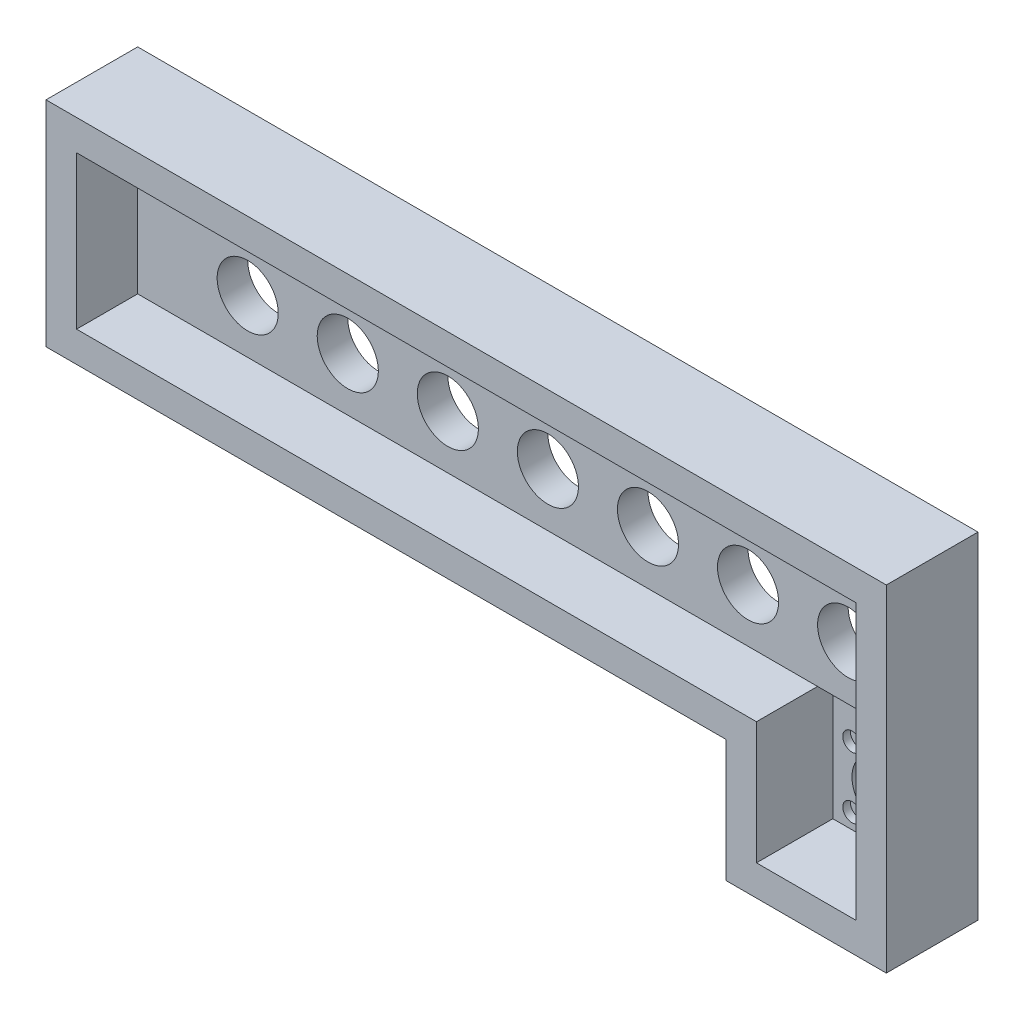
ISO-10303-21;
HEADER;
FILE_DESCRIPTION(('STEP AP214'),'2;1');
FILE_NAME('part.step','',(''),(''),'','','');
FILE_SCHEMA(('AUTOMOTIVE_DESIGN { 1 0 10303 214 1 1 1 1 }'));
ENDSEC;
DATA;
#1=APPLICATION_CONTEXT('core data for automotive mechanical design processes');
#2=APPLICATION_PROTOCOL_DEFINITION('international standard','automotive_design',2000,#1);
#3=PRODUCT_CONTEXT('',#1,'mechanical');
#4=PRODUCT('Part','Part','',(#3));
#5=PRODUCT_RELATED_PRODUCT_CATEGORY('part','',(#4));
#6=PRODUCT_DEFINITION_FORMATION('','',#4);
#7=PRODUCT_DEFINITION_CONTEXT('part definition',#1,'design');
#8=PRODUCT_DEFINITION('design','',#6,#7);
#9=PRODUCT_DEFINITION_SHAPE('','',#8);
#10=(LENGTH_UNIT() NAMED_UNIT(*) SI_UNIT(.MILLI.,.METRE.));
#11=(NAMED_UNIT(*) PLANE_ANGLE_UNIT() SI_UNIT($,.RADIAN.));
#12=(NAMED_UNIT(*) SI_UNIT($,.STERADIAN.) SOLID_ANGLE_UNIT());
#13=UNCERTAINTY_MEASURE_WITH_UNIT(LENGTH_MEASURE(1.E-05),#10,'distance_accuracy_value','');
#14=(GEOMETRIC_REPRESENTATION_CONTEXT(3) GLOBAL_UNCERTAINTY_ASSIGNED_CONTEXT((#13)) GLOBAL_UNIT_ASSIGNED_CONTEXT((#10,
#11,#12)) REPRESENTATION_CONTEXT('',''));
#15=CARTESIAN_POINT('',(0.,0.,0.));
#16=DIRECTION('',(0.,0.,1.));
#17=DIRECTION('',(1.,0.,0.));
#18=AXIS2_PLACEMENT_3D('',#15,#16,#17);
#19=CARTESIAN_POINT('',(22.25,-10.,0.));
#20=DIRECTION('',(0.,0.,1.));
#21=DIRECTION('',(1.,0.,0.));
#22=AXIS2_PLACEMENT_3D('',#19,#20,#21);
#23=CYLINDRICAL_SURFACE('',#22,2.);
#24=CARTESIAN_POINT('',(22.25,-10.,0.));
#25=DIRECTION('',(0.,0.,1.));
#26=DIRECTION('',(1.,0.,0.));
#27=AXIS2_PLACEMENT_3D('',#24,#25,#26);
#28=CIRCLE('',#27,2.);
#29=CARTESIAN_POINT('',(24.25,-10.,0.));
#30=VERTEX_POINT('',#29);
#31=EDGE_CURVE('E177',#30,#30,#28,.T.);
#32=ORIENTED_EDGE('',*,*,#31,.F.);
#33=EDGE_LOOP('',(#32));
#34=FACE_BOUND('',#33,.T.);
#35=CARTESIAN_POINT('',(22.25,-10.,1.));
#36=DIRECTION('',(0.,0.,1.));
#37=DIRECTION('',(1.,0.,0.));
#38=AXIS2_PLACEMENT_3D('',#35,#36,#37);
#39=CIRCLE('',#38,2.);
#40=CARTESIAN_POINT('',(24.25,-10.,1.));
#41=VERTEX_POINT('',#40);
#42=EDGE_CURVE('E49',#41,#41,#39,.F.);
#43=ORIENTED_EDGE('',*,*,#42,.F.);
#44=EDGE_LOOP('',(#43));
#45=FACE_BOUND('',#44,.T.);
#46=ADVANCED_FACE('F45',(#34,#45),#23,.F.);
#47=CARTESIAN_POINT('',(0.,0.,6.));
#48=DIRECTION('',(0.,0.,-1.));
#49=DIRECTION('',(-1.,0.,0.));
#50=AXIS2_PLACEMENT_3D('',#47,#48,#49);
#51=PLANE('',#50);
#52=DIRECTION('',(0.,1.,0.));
#53=VECTOR('',#52,1.);
#54=CARTESIAN_POINT('',(27.5,-7.,6.));
#55=LINE('',#54,#53);
#56=CARTESIAN_POINT('',(27.5,-15.,6.));
#57=VERTEX_POINT('',#56);
#58=CARTESIAN_POINT('',(27.5,7.,6.));
#59=VERTEX_POINT('',#58);
#60=EDGE_CURVE('E246',#57,#59,#55,.T.);
#61=ORIENTED_EDGE('',*,*,#60,.T.);
#62=DIRECTION('',(-1.,0.,0.));
#63=VECTOR('',#62,1.);
#64=CARTESIAN_POINT('',(-27.5,7.,6.));
#65=LINE('',#64,#63);
#66=CARTESIAN_POINT('',(-27.5,7.,6.));
#67=VERTEX_POINT('',#66);
#68=EDGE_CURVE('E249',#59,#67,#65,.T.);
#69=ORIENTED_EDGE('',*,*,#68,.T.);
#70=DIRECTION('',(0.,-1.,0.));
#71=VECTOR('',#70,1.);
#72=CARTESIAN_POINT('',(-27.5,-7.,6.));
#73=LINE('',#72,#71);
#74=CARTESIAN_POINT('',(-27.5,-7.,6.));
#75=VERTEX_POINT('',#74);
#76=EDGE_CURVE('E252',#67,#75,#73,.T.);
#77=ORIENTED_EDGE('',*,*,#76,.T.);
#78=DIRECTION('',(1.,0.,0.));
#79=VECTOR('',#78,1.);
#80=CARTESIAN_POINT('',(17.,-7.00000000000001,6.));
#81=LINE('',#80,#79);
#82=CARTESIAN_POINT('',(17.,-7.00000000000001,6.));
#83=VERTEX_POINT('',#82);
#84=EDGE_CURVE('E254',#75,#83,#81,.T.);
#85=ORIENTED_EDGE('',*,*,#84,.T.);
#86=DIRECTION('',(0.,-1.,0.));
#87=VECTOR('',#86,1.);
#88=CARTESIAN_POINT('',(17.,-7.00000000000001,6.));
#89=LINE('',#88,#87);
#90=CARTESIAN_POINT('',(17.,-15.,6.));
#91=VERTEX_POINT('',#90);
#92=EDGE_CURVE('E256',#83,#91,#89,.T.);
#93=ORIENTED_EDGE('',*,*,#92,.T.);
#94=DIRECTION('',(1.,0.,0.));
#95=VECTOR('',#94,1.);
#96=CARTESIAN_POINT('',(27.5,-15.,6.));
#97=LINE('',#96,#95);
#98=EDGE_CURVE('E258',#91,#57,#97,.T.);
#99=ORIENTED_EDGE('',*,*,#98,.T.);
#100=EDGE_LOOP('',(#61,#69,#77,#85,#93,#99));
#101=FACE_BOUND('',#100,.T.);
#102=DIRECTION('',(0.,1.,0.));
#103=VECTOR('',#102,1.);
#104=CARTESIAN_POINT('',(25.5,0.,6.));
#105=LINE('',#104,#103);
#106=CARTESIAN_POINT('',(25.5,-13.,6.));
#107=VERTEX_POINT('',#106);
#108=CARTESIAN_POINT('',(25.5,5.,6.));
#109=VERTEX_POINT('',#108);
#110=EDGE_CURVE('E235',#107,#109,#105,.T.);
#111=ORIENTED_EDGE('',*,*,#110,.F.);
#112=DIRECTION('',(1.,0.,0.));
#113=VECTOR('',#112,1.);
#114=CARTESIAN_POINT('',(0.,-13.,6.));
#115=LINE('',#114,#113);
#116=CARTESIAN_POINT('',(19.,-13.,6.));
#117=VERTEX_POINT('',#116);
#118=EDGE_CURVE('E233',#117,#107,#115,.T.);
#119=ORIENTED_EDGE('',*,*,#118,.F.);
#120=DIRECTION('',(0.,-1.,0.));
#121=VECTOR('',#120,1.);
#122=CARTESIAN_POINT('',(19.,0.,6.));
#123=LINE('',#122,#121);
#124=CARTESIAN_POINT('',(19.,-5.00000000000001,6.));
#125=VERTEX_POINT('',#124);
#126=EDGE_CURVE('E242',#125,#117,#123,.T.);
#127=ORIENTED_EDGE('',*,*,#126,.F.);
#128=DIRECTION('',(1.,0.,0.));
#129=VECTOR('',#128,1.);
#130=CARTESIAN_POINT('',(0.,-5.,6.));
#131=LINE('',#130,#129);
#132=CARTESIAN_POINT('',(-25.5,-5.,6.));
#133=VERTEX_POINT('',#132);
#134=EDGE_CURVE('E240',#133,#125,#131,.T.);
#135=ORIENTED_EDGE('',*,*,#134,.F.);
#136=DIRECTION('',(0.,-1.,0.));
#137=VECTOR('',#136,1.);
#138=CARTESIAN_POINT('',(-25.5,0.,6.));
#139=LINE('',#138,#137);
#140=CARTESIAN_POINT('',(-25.5,5.,6.));
#141=VERTEX_POINT('',#140);
#142=EDGE_CURVE('E238',#141,#133,#139,.T.);
#143=ORIENTED_EDGE('',*,*,#142,.F.);
#144=DIRECTION('',(-1.,0.,0.));
#145=VECTOR('',#144,1.);
#146=CARTESIAN_POINT('',(0.,5.,6.));
#147=LINE('',#146,#145);
#148=EDGE_CURVE('E236',#109,#141,#147,.T.);
#149=ORIENTED_EDGE('',*,*,#148,.F.);
#150=EDGE_LOOP('',(#111,#119,#127,#135,#143,#149));
#151=FACE_BOUND('',#150,.T.);
#152=ADVANCED_FACE('F327',(#101,#151),#51,.F.);
#153=CARTESIAN_POINT('',(-27.5,7.,6.));
#154=DIRECTION('',(0.,-1.,0.));
#155=DIRECTION('',(0.,0.,-1.));
#156=AXIS2_PLACEMENT_3D('',#153,#154,#155);
#157=PLANE('',#156);
#158=DIRECTION('',(-1.,0.,0.));
#159=VECTOR('',#158,1.);
#160=CARTESIAN_POINT('',(-27.5,7.,0.));
#161=LINE('',#160,#159);
#162=CARTESIAN_POINT('',(27.5,7.,0.));
#163=VERTEX_POINT('',#162);
#164=CARTESIAN_POINT('',(-27.5,7.,0.));
#165=VERTEX_POINT('',#164);
#166=EDGE_CURVE('E220',#163,#165,#161,.T.);
#167=ORIENTED_EDGE('',*,*,#166,.T.);
#168=DIRECTION('',(0.,0.,-1.));
#169=VECTOR('',#168,1.);
#170=CARTESIAN_POINT('',(-27.5,7.,6.));
#171=LINE('',#170,#169);
#172=EDGE_CURVE('E54',#67,#165,#171,.T.);
#173=ORIENTED_EDGE('',*,*,#172,.F.);
#174=ORIENTED_EDGE('',*,*,#68,.F.);
#175=DIRECTION('',(0.,0.,-1.));
#176=VECTOR('',#175,1.);
#177=CARTESIAN_POINT('',(27.5,7.,6.));
#178=LINE('',#177,#176);
#179=EDGE_CURVE('E13',#59,#163,#178,.T.);
#180=ORIENTED_EDGE('',*,*,#179,.T.);
#181=EDGE_LOOP('',(#167,#173,#174,#180));
#182=FACE_BOUND('',#181,.T.);
#183=ADVANCED_FACE('F47',(#182),#157,.F.);
#184=CARTESIAN_POINT('',(-27.5,-7.,6.));
#185=DIRECTION('',(1.,0.,0.));
#186=DIRECTION('',(0.,0.,-1.));
#187=AXIS2_PLACEMENT_3D('',#184,#185,#186);
#188=PLANE('',#187);
#189=DIRECTION('',(0.,-1.,0.));
#190=VECTOR('',#189,1.);
#191=CARTESIAN_POINT('',(-27.5,-7.,0.));
#192=LINE('',#191,#190);
#193=CARTESIAN_POINT('',(-27.5,-7.,0.));
#194=VERTEX_POINT('',#193);
#195=EDGE_CURVE('E263',#165,#194,#192,.T.);
#196=ORIENTED_EDGE('',*,*,#195,.T.);
#197=DIRECTION('',(0.,0.,-1.));
#198=VECTOR('',#197,1.);
#199=CARTESIAN_POINT('',(-27.5,-7.,6.));
#200=LINE('',#199,#198);
#201=EDGE_CURVE('E280',#75,#194,#200,.T.);
#202=ORIENTED_EDGE('',*,*,#201,.F.);
#203=ORIENTED_EDGE('',*,*,#76,.F.);
#204=ORIENTED_EDGE('',*,*,#172,.T.);
#205=EDGE_LOOP('',(#196,#202,#203,#204));
#206=FACE_BOUND('',#205,.T.);
#207=ADVANCED_FACE('F651',(#206),#188,.F.);
#208=CARTESIAN_POINT('',(17.,-7.00000000000001,6.));
#209=DIRECTION('',(0.,1.,0.));
#210=DIRECTION('',(-1.,0.,0.));
#211=AXIS2_PLACEMENT_3D('',#208,#209,#210);
#212=PLANE('',#211);
#213=DIRECTION('',(1.,0.,0.));
#214=VECTOR('',#213,1.);
#215=CARTESIAN_POINT('',(17.,-7.00000000000001,0.));
#216=LINE('',#215,#214);
#217=CARTESIAN_POINT('',(17.,-7.00000000000001,0.));
#218=VERTEX_POINT('',#217);
#219=EDGE_CURVE('E265',#194,#218,#216,.T.);
#220=ORIENTED_EDGE('',*,*,#219,.T.);
#221=DIRECTION('',(0.,0.,-1.));
#222=VECTOR('',#221,1.);
#223=CARTESIAN_POINT('',(17.,-7.00000000000001,6.));
#224=LINE('',#223,#222);
#225=EDGE_CURVE('E277',#83,#218,#224,.T.);
#226=ORIENTED_EDGE('',*,*,#225,.F.);
#227=ORIENTED_EDGE('',*,*,#84,.F.);
#228=ORIENTED_EDGE('',*,*,#201,.T.);
#229=EDGE_LOOP('',(#220,#226,#227,#228));
#230=FACE_BOUND('',#229,.T.);
#231=ADVANCED_FACE('F643',(#230),#212,.F.);
#232=CARTESIAN_POINT('',(17.,-7.00000000000001,6.));
#233=DIRECTION('',(1.,0.,0.));
#234=DIRECTION('',(0.,1.,0.));
#235=AXIS2_PLACEMENT_3D('',#232,#233,#234);
#236=PLANE('',#235);
#237=DIRECTION('',(0.,-1.,0.));
#238=VECTOR('',#237,1.);
#239=CARTESIAN_POINT('',(17.,-7.00000000000001,0.));
#240=LINE('',#239,#238);
#241=CARTESIAN_POINT('',(17.,-15.,0.));
#242=VERTEX_POINT('',#241);
#243=EDGE_CURVE('E267',#218,#242,#240,.T.);
#244=ORIENTED_EDGE('',*,*,#243,.T.);
#245=DIRECTION('',(0.,0.,-1.));
#246=VECTOR('',#245,1.);
#247=CARTESIAN_POINT('',(17.,-15.,6.));
#248=LINE('',#247,#246);
#249=EDGE_CURVE('E274',#91,#242,#248,.T.);
#250=ORIENTED_EDGE('',*,*,#249,.F.);
#251=ORIENTED_EDGE('',*,*,#92,.F.);
#252=ORIENTED_EDGE('',*,*,#225,.T.);
#253=EDGE_LOOP('',(#244,#250,#251,#252));
#254=FACE_BOUND('',#253,.T.);
#255=ADVANCED_FACE('F635',(#254),#236,.F.);
#256=CARTESIAN_POINT('',(27.5,-15.,6.));
#257=DIRECTION('',(0.,1.,0.));
#258=DIRECTION('',(-1.,0.,0.));
#259=AXIS2_PLACEMENT_3D('',#256,#257,#258);
#260=PLANE('',#259);
#261=DIRECTION('',(1.,0.,0.));
#262=VECTOR('',#261,1.);
#263=CARTESIAN_POINT('',(27.5,-15.,0.));
#264=LINE('',#263,#262);
#265=CARTESIAN_POINT('',(27.5,-15.,0.));
#266=VERTEX_POINT('',#265);
#267=EDGE_CURVE('E269',#242,#266,#264,.T.);
#268=ORIENTED_EDGE('',*,*,#267,.T.);
#269=DIRECTION('',(0.,0.,-1.));
#270=VECTOR('',#269,1.);
#271=CARTESIAN_POINT('',(27.5,-15.,6.));
#272=LINE('',#271,#270);
#273=EDGE_CURVE('E261',#57,#266,#272,.T.);
#274=ORIENTED_EDGE('',*,*,#273,.F.);
#275=ORIENTED_EDGE('',*,*,#98,.F.);
#276=ORIENTED_EDGE('',*,*,#249,.T.);
#277=EDGE_LOOP('',(#268,#274,#275,#276));
#278=FACE_BOUND('',#277,.T.);
#279=ADVANCED_FACE('F627',(#278),#260,.F.);
#280=CARTESIAN_POINT('',(27.5,-7.,6.));
#281=DIRECTION('',(-1.,0.,0.));
#282=DIRECTION('',(0.,0.,1.));
#283=AXIS2_PLACEMENT_3D('',#280,#281,#282);
#284=PLANE('',#283);
#285=DIRECTION('',(0.,1.,0.));
#286=VECTOR('',#285,1.);
#287=CARTESIAN_POINT('',(27.5,-7.,0.));
#288=LINE('',#287,#286);
#289=EDGE_CURVE('E250',#266,#163,#288,.T.);
#290=ORIENTED_EDGE('',*,*,#289,.T.);
#291=ORIENTED_EDGE('',*,*,#179,.F.);
#292=ORIENTED_EDGE('',*,*,#60,.F.);
#293=ORIENTED_EDGE('',*,*,#273,.T.);
#294=EDGE_LOOP('',(#290,#291,#292,#293));
#295=FACE_BOUND('',#294,.T.);
#296=ADVANCED_FACE('F619',(#295),#284,.F.);
#297=CARTESIAN_POINT('',(0.,0.,0.));
#298=DIRECTION('',(0.,0.,-1.));
#299=DIRECTION('',(-1.,0.,0.));
#300=AXIS2_PLACEMENT_3D('',#297,#298,#299);
#301=PLANE('',#300);
#302=ORIENTED_EDGE('',*,*,#31,.T.);
#303=EDGE_LOOP('',(#302));
#304=FACE_BOUND('',#303,.T.);
#305=CARTESIAN_POINT('',(17.5,2.8,0.));
#306=DIRECTION('',(0.,0.,-1.));
#307=DIRECTION('',(-1.,0.,0.));
#308=AXIS2_PLACEMENT_3D('',#305,#306,#307);
#309=CIRCLE('',#308,1.5);
#310=CARTESIAN_POINT('',(16.,2.8,0.));
#311=VERTEX_POINT('',#310);
#312=EDGE_CURVE('E181',#311,#311,#309,.T.);
#313=ORIENTED_EDGE('',*,*,#312,.F.);
#314=EDGE_LOOP('',(#313));
#315=FACE_BOUND('',#314,.T.);
#316=CARTESIAN_POINT('',(-8.5,2.8,0.));
#317=DIRECTION('',(0.,0.,-1.));
#318=DIRECTION('',(-1.,0.,0.));
#319=AXIS2_PLACEMENT_3D('',#316,#317,#318);
#320=CIRCLE('',#319,1.5);
#321=CARTESIAN_POINT('',(-10.,2.8,0.));
#322=VERTEX_POINT('',#321);
#323=EDGE_CURVE('E180',#322,#322,#320,.T.);
#324=ORIENTED_EDGE('',*,*,#323,.F.);
#325=EDGE_LOOP('',(#324));
#326=FACE_BOUND('',#325,.T.);
#327=CARTESIAN_POINT('',(21.,-1.5,0.));
#328=DIRECTION('',(0.,0.,-1.));
#329=DIRECTION('',(-1.,0.,0.));
#330=AXIS2_PLACEMENT_3D('',#327,#328,#329);
#331=CIRCLE('',#330,2.);
#332=CARTESIAN_POINT('',(19.,-1.5,0.));
#333=VERTEX_POINT('',#332);
#334=EDGE_CURVE('E187',#333,#333,#331,.T.);
#335=ORIENTED_EDGE('',*,*,#334,.F.);
#336=EDGE_LOOP('',(#335));
#337=FACE_BOUND('',#336,.T.);
#338=CARTESIAN_POINT('',(14.45,-1.5,0.));
#339=DIRECTION('',(0.,0.,-1.));
#340=DIRECTION('',(-1.,0.,0.));
#341=AXIS2_PLACEMENT_3D('',#338,#339,#340);
#342=CIRCLE('',#341,2.);
#343=CARTESIAN_POINT('',(12.45,-1.5,0.));
#344=VERTEX_POINT('',#343);
#345=EDGE_CURVE('E191',#344,#344,#342,.T.);
#346=ORIENTED_EDGE('',*,*,#345,.F.);
#347=EDGE_LOOP('',(#346));
#348=FACE_BOUND('',#347,.T.);
#349=CARTESIAN_POINT('',(7.9,-1.5,0.));
#350=DIRECTION('',(0.,0.,-1.));
#351=DIRECTION('',(-1.,0.,0.));
#352=AXIS2_PLACEMENT_3D('',#349,#350,#351);
#353=CIRCLE('',#352,2.);
#354=CARTESIAN_POINT('',(5.9,-1.5,0.));
#355=VERTEX_POINT('',#354);
#356=EDGE_CURVE('E194',#355,#355,#353,.T.);
#357=ORIENTED_EDGE('',*,*,#356,.F.);
#358=EDGE_LOOP('',(#357));
#359=FACE_BOUND('',#358,.T.);
#360=CARTESIAN_POINT('',(1.35,-1.5,0.));
#361=DIRECTION('',(0.,0.,-1.));
#362=DIRECTION('',(-1.,0.,0.));
#363=AXIS2_PLACEMENT_3D('',#360,#361,#362);
#364=CIRCLE('',#363,2.);
#365=CARTESIAN_POINT('',(-0.649999999999999,-1.5,0.));
#366=VERTEX_POINT('',#365);
#367=EDGE_CURVE('E197',#366,#366,#364,.T.);
#368=ORIENTED_EDGE('',*,*,#367,.F.);
#369=EDGE_LOOP('',(#368));
#370=FACE_BOUND('',#369,.T.);
#371=CARTESIAN_POINT('',(-5.2,-1.5,0.));
#372=DIRECTION('',(0.,0.,-1.));
#373=DIRECTION('',(-1.,0.,0.));
#374=AXIS2_PLACEMENT_3D('',#371,#372,#373);
#375=CIRCLE('',#374,2.);
#376=CARTESIAN_POINT('',(-7.2,-1.5,0.));
#377=VERTEX_POINT('',#376);
#378=EDGE_CURVE('E200',#377,#377,#375,.T.);
#379=ORIENTED_EDGE('',*,*,#378,.F.);
#380=EDGE_LOOP('',(#379));
#381=FACE_BOUND('',#380,.T.);
#382=CARTESIAN_POINT('',(-11.75,-1.5,0.));
#383=DIRECTION('',(0.,0.,-1.));
#384=DIRECTION('',(-1.,0.,0.));
#385=AXIS2_PLACEMENT_3D('',#382,#383,#384);
#386=CIRCLE('',#385,2.);
#387=CARTESIAN_POINT('',(-13.75,-1.5,0.));
#388=VERTEX_POINT('',#387);
#389=EDGE_CURVE('E203',#388,#388,#386,.T.);
#390=ORIENTED_EDGE('',*,*,#389,.F.);
#391=EDGE_LOOP('',(#390));
#392=FACE_BOUND('',#391,.T.);
#393=CARTESIAN_POINT('',(-18.3,-1.5,0.));
#394=DIRECTION('',(0.,0.,-1.));
#395=DIRECTION('',(-1.,0.,0.));
#396=AXIS2_PLACEMENT_3D('',#393,#394,#395);
#397=CIRCLE('',#396,2.);
#398=CARTESIAN_POINT('',(-20.3,-1.5,0.));
#399=VERTEX_POINT('',#398);
#400=EDGE_CURVE('E206',#399,#399,#397,.T.);
#401=ORIENTED_EDGE('',*,*,#400,.F.);
#402=EDGE_LOOP('',(#401));
#403=FACE_BOUND('',#402,.T.);
#404=ORIENTED_EDGE('',*,*,#166,.F.);
#405=ORIENTED_EDGE('',*,*,#289,.F.);
#406=ORIENTED_EDGE('',*,*,#267,.F.);
#407=ORIENTED_EDGE('',*,*,#243,.F.);
#408=ORIENTED_EDGE('',*,*,#219,.F.);
#409=ORIENTED_EDGE('',*,*,#195,.F.);
#410=EDGE_LOOP('',(#404,#405,#406,#407,#408,#409));
#411=FACE_BOUND('',#410,.T.);
#412=ADVANCED_FACE('F611',(#304,#315,#326,#337,#348,#359,#370,#381,#392,#403,#411),#301,.T.);
#413=CARTESIAN_POINT('',(-27.5,5.,6.));
#414=DIRECTION('',(0.,-1.,0.));
#415=DIRECTION('',(0.,0.,-1.));
#416=AXIS2_PLACEMENT_3D('',#413,#414,#415);
#417=PLANE('',#416);
#418=DIRECTION('',(-1.,0.,0.));
#419=VECTOR('',#418,1.);
#420=CARTESIAN_POINT('',(0.,5.,2.));
#421=LINE('',#420,#419);
#422=CARTESIAN_POINT('',(25.5,5.,2.));
#423=VERTEX_POINT('',#422);
#424=CARTESIAN_POINT('',(-25.5,5.,2.));
#425=VERTEX_POINT('',#424);
#426=EDGE_CURVE('E210',#423,#425,#421,.T.);
#427=ORIENTED_EDGE('',*,*,#426,.F.);
#428=DIRECTION('',(0.,0.,-1.));
#429=VECTOR('',#428,1.);
#430=CARTESIAN_POINT('',(25.5,5.,6.));
#431=LINE('',#430,#429);
#432=EDGE_CURVE('E217',#109,#423,#431,.T.);
#433=ORIENTED_EDGE('',*,*,#432,.F.);
#434=ORIENTED_EDGE('',*,*,#148,.T.);
#435=DIRECTION('',(0.,0.,-1.));
#436=VECTOR('',#435,1.);
#437=CARTESIAN_POINT('',(-25.5,5.,6.));
#438=LINE('',#437,#436);
#439=EDGE_CURVE('E214',#141,#425,#438,.T.);
#440=ORIENTED_EDGE('',*,*,#439,.T.);
#441=EDGE_LOOP('',(#427,#433,#434,#440));
#442=FACE_BOUND('',#441,.T.);
#443=ADVANCED_FACE('F603',(#442),#417,.T.);
#444=CARTESIAN_POINT('',(-25.5,-7.,6.));
#445=DIRECTION('',(1.,0.,0.));
#446=DIRECTION('',(0.,0.,-1.));
#447=AXIS2_PLACEMENT_3D('',#444,#445,#446);
#448=PLANE('',#447);
#449=DIRECTION('',(0.,-1.,0.));
#450=VECTOR('',#449,1.);
#451=CARTESIAN_POINT('',(-25.5,0.,2.));
#452=LINE('',#451,#450);
#453=CARTESIAN_POINT('',(-25.5,-5.,2.));
#454=VERTEX_POINT('',#453);
#455=EDGE_CURVE('E212',#425,#454,#452,.T.);
#456=ORIENTED_EDGE('',*,*,#455,.F.);
#457=ORIENTED_EDGE('',*,*,#439,.F.);
#458=ORIENTED_EDGE('',*,*,#142,.T.);
#459=DIRECTION('',(0.,0.,-1.));
#460=VECTOR('',#459,1.);
#461=CARTESIAN_POINT('',(-25.5,-5.,6.));
#462=LINE('',#461,#460);
#463=EDGE_CURVE('E218',#133,#454,#462,.T.);
#464=ORIENTED_EDGE('',*,*,#463,.T.);
#465=EDGE_LOOP('',(#456,#457,#458,#464));
#466=FACE_BOUND('',#465,.T.);
#467=ADVANCED_FACE('F597',(#466),#448,.T.);
#468=CARTESIAN_POINT('',(17.,-5.00000000000001,6.));
#469=DIRECTION('',(0.,1.,0.));
#470=DIRECTION('',(-1.,0.,0.));
#471=AXIS2_PLACEMENT_3D('',#468,#469,#470);
#472=PLANE('',#471);
#473=DIRECTION('',(1.,0.,0.));
#474=VECTOR('',#473,1.);
#475=CARTESIAN_POINT('',(0.,-5.,2.));
#476=LINE('',#475,#474);
#477=CARTESIAN_POINT('',(19.,-5.00000000000001,2.));
#478=VERTEX_POINT('',#477);
#479=EDGE_CURVE('E222',#454,#478,#476,.T.);
#480=ORIENTED_EDGE('',*,*,#479,.F.);
#481=ORIENTED_EDGE('',*,*,#463,.F.);
#482=ORIENTED_EDGE('',*,*,#134,.T.);
#483=DIRECTION('',(0.,0.,-1.));
#484=VECTOR('',#483,1.);
#485=CARTESIAN_POINT('',(19.,-5.00000000000001,6.));
#486=LINE('',#485,#484);
#487=EDGE_CURVE('E225',#125,#478,#486,.T.);
#488=ORIENTED_EDGE('',*,*,#487,.T.);
#489=EDGE_LOOP('',(#480,#481,#482,#488));
#490=FACE_BOUND('',#489,.T.);
#491=ADVANCED_FACE('F493',(#490),#472,.T.);
#492=CARTESIAN_POINT('',(19.,-7.00000000000001,6.));
#493=DIRECTION('',(1.,0.,0.));
#494=DIRECTION('',(0.,1.,0.));
#495=AXIS2_PLACEMENT_3D('',#492,#493,#494);
#496=PLANE('',#495);
#497=DIRECTION('',(0.,0.,-1.));
#498=VECTOR('',#497,1.);
#499=CARTESIAN_POINT('',(19.,-13.,6.));
#500=LINE('',#499,#498);
#501=CARTESIAN_POINT('',(19.,-13.,1.));
#502=VERTEX_POINT('',#501);
#503=EDGE_CURVE('E70',#117,#502,#500,.T.);
#504=ORIENTED_EDGE('',*,*,#503,.T.);
#505=DIRECTION('',(0.,-1.,0.));
#506=VECTOR('',#505,1.);
#507=CARTESIAN_POINT('',(19.,-13.,1.));
#508=LINE('',#507,#506);
#509=CARTESIAN_POINT('',(19.,-5.00000000000001,1.));
#510=VERTEX_POINT('',#509);
#511=EDGE_CURVE('E162',#510,#502,#508,.T.);
#512=ORIENTED_EDGE('',*,*,#511,.F.);
#513=DIRECTION('',(0.,0.,1.));
#514=VECTOR('',#513,1.);
#515=CARTESIAN_POINT('',(19.,-5.00000000000001,1.));
#516=LINE('',#515,#514);
#517=EDGE_CURVE('E153',#510,#478,#516,.T.);
#518=ORIENTED_EDGE('',*,*,#517,.T.);
#519=ORIENTED_EDGE('',*,*,#487,.F.);
#520=ORIENTED_EDGE('',*,*,#126,.T.);
#521=EDGE_LOOP('',(#504,#512,#518,#519,#520));
#522=FACE_BOUND('',#521,.T.);
#523=ADVANCED_FACE('F482',(#522),#496,.T.);
#524=CARTESIAN_POINT('',(27.5,-13.,6.));
#525=DIRECTION('',(0.,1.,0.));
#526=DIRECTION('',(-1.,0.,0.));
#527=AXIS2_PLACEMENT_3D('',#524,#525,#526);
#528=PLANE('',#527);
#529=DIRECTION('',(0.,0.,-1.));
#530=VECTOR('',#529,1.);
#531=CARTESIAN_POINT('',(25.5,-13.,6.));
#532=LINE('',#531,#530);
#533=CARTESIAN_POINT('',(25.5,-13.,1.));
#534=VERTEX_POINT('',#533);
#535=EDGE_CURVE('E231',#107,#534,#532,.T.);
#536=ORIENTED_EDGE('',*,*,#535,.T.);
#537=DIRECTION('',(1.,0.,0.));
#538=VECTOR('',#537,1.);
#539=CARTESIAN_POINT('',(25.5,-13.,1.));
#540=LINE('',#539,#538);
#541=EDGE_CURVE('E154',#502,#534,#540,.T.);
#542=ORIENTED_EDGE('',*,*,#541,.F.);
#543=ORIENTED_EDGE('',*,*,#503,.F.);
#544=ORIENTED_EDGE('',*,*,#118,.T.);
#545=EDGE_LOOP('',(#536,#542,#543,#544));
#546=FACE_BOUND('',#545,.T.);
#547=ADVANCED_FACE('F469',(#546),#528,.T.);
#548=CARTESIAN_POINT('',(25.5,-7.,6.));
#549=DIRECTION('',(-1.,0.,0.));
#550=DIRECTION('',(0.,0.,1.));
#551=AXIS2_PLACEMENT_3D('',#548,#549,#550);
#552=PLANE('',#551);
#553=DIRECTION('',(0.,1.,0.));
#554=VECTOR('',#553,1.);
#555=CARTESIAN_POINT('',(25.5,0.,2.));
#556=LINE('',#555,#554);
#557=CARTESIAN_POINT('',(25.5,-5.00000000000001,2.));
#558=VERTEX_POINT('',#557);
#559=EDGE_CURVE('E152',#558,#423,#556,.T.);
#560=ORIENTED_EDGE('',*,*,#559,.F.);
#561=DIRECTION('',(0.,0.,1.));
#562=VECTOR('',#561,1.);
#563=CARTESIAN_POINT('',(25.5,-5.00000000000001,1.));
#564=LINE('',#563,#562);
#565=CARTESIAN_POINT('',(25.5,-5.00000000000001,1.));
#566=VERTEX_POINT('',#565);
#567=EDGE_CURVE('E62',#566,#558,#564,.T.);
#568=ORIENTED_EDGE('',*,*,#567,.F.);
#569=DIRECTION('',(0.,1.,0.));
#570=VECTOR('',#569,1.);
#571=CARTESIAN_POINT('',(25.5,-13.,1.));
#572=LINE('',#571,#570);
#573=EDGE_CURVE('E149',#534,#566,#572,.T.);
#574=ORIENTED_EDGE('',*,*,#573,.F.);
#575=ORIENTED_EDGE('',*,*,#535,.F.);
#576=ORIENTED_EDGE('',*,*,#110,.T.);
#577=ORIENTED_EDGE('',*,*,#432,.T.);
#578=EDGE_LOOP('',(#560,#568,#574,#575,#576,#577));
#579=FACE_BOUND('',#578,.T.);
#580=ADVANCED_FACE('F146',(#579),#552,.T.);
#581=CARTESIAN_POINT('',(0.,0.,2.));
#582=DIRECTION('',(0.,0.,-1.));
#583=DIRECTION('',(-1.,0.,0.));
#584=AXIS2_PLACEMENT_3D('',#581,#582,#583);
#585=PLANE('',#584);
#586=CARTESIAN_POINT('',(17.5,2.8,2.));
#587=DIRECTION('',(0.,0.,-1.));
#588=DIRECTION('',(-1.,0.,0.));
#589=AXIS2_PLACEMENT_3D('',#586,#587,#588);
#590=CIRCLE('',#589,1.5);
#591=CARTESIAN_POINT('',(16.,2.8,2.));
#592=VERTEX_POINT('',#591);
#593=EDGE_CURVE('E209',#592,#592,#590,.T.);
#594=ORIENTED_EDGE('',*,*,#593,.T.);
#595=EDGE_LOOP('',(#594));
#596=FACE_BOUND('',#595,.T.);
#597=CARTESIAN_POINT('',(-8.5,2.8,2.));
#598=DIRECTION('',(0.,0.,-1.));
#599=DIRECTION('',(-1.,0.,0.));
#600=AXIS2_PLACEMENT_3D('',#597,#598,#599);
#601=CIRCLE('',#600,1.5);
#602=CARTESIAN_POINT('',(-10.,2.8,2.));
#603=VERTEX_POINT('',#602);
#604=EDGE_CURVE('E184',#603,#603,#601,.T.);
#605=ORIENTED_EDGE('',*,*,#604,.T.);
#606=EDGE_LOOP('',(#605));
#607=FACE_BOUND('',#606,.T.);
#608=CARTESIAN_POINT('',(21.,-1.5,2.));
#609=DIRECTION('',(0.,0.,-1.));
#610=DIRECTION('',(-1.,0.,0.));
#611=AXIS2_PLACEMENT_3D('',#608,#609,#610);
#612=CIRCLE('',#611,2.);
#613=CARTESIAN_POINT('',(19.,-1.5,2.));
#614=VERTEX_POINT('',#613);
#615=EDGE_CURVE('E213',#614,#614,#612,.T.);
#616=ORIENTED_EDGE('',*,*,#615,.T.);
#617=EDGE_LOOP('',(#616));
#618=FACE_BOUND('',#617,.T.);
#619=CARTESIAN_POINT('',(14.45,-1.5,2.));
#620=DIRECTION('',(0.,0.,-1.));
#621=DIRECTION('',(-1.,0.,0.));
#622=AXIS2_PLACEMENT_3D('',#619,#620,#621);
#623=CIRCLE('',#622,2.);
#624=CARTESIAN_POINT('',(12.45,-1.5,2.));
#625=VERTEX_POINT('',#624);
#626=EDGE_CURVE('E299',#625,#625,#623,.T.);
#627=ORIENTED_EDGE('',*,*,#626,.T.);
#628=EDGE_LOOP('',(#627));
#629=FACE_BOUND('',#628,.T.);
#630=CARTESIAN_POINT('',(7.9,-1.5,2.));
#631=DIRECTION('',(0.,0.,-1.));
#632=DIRECTION('',(-1.,0.,0.));
#633=AXIS2_PLACEMENT_3D('',#630,#631,#632);
#634=CIRCLE('',#633,2.);
#635=CARTESIAN_POINT('',(5.9,-1.5,2.));
#636=VERTEX_POINT('',#635);
#637=EDGE_CURVE('E296',#636,#636,#634,.T.);
#638=ORIENTED_EDGE('',*,*,#637,.T.);
#639=EDGE_LOOP('',(#638));
#640=FACE_BOUND('',#639,.T.);
#641=CARTESIAN_POINT('',(1.35,-1.5,2.));
#642=DIRECTION('',(0.,0.,-1.));
#643=DIRECTION('',(-1.,0.,0.));
#644=AXIS2_PLACEMENT_3D('',#641,#642,#643);
#645=CIRCLE('',#644,2.);
#646=CARTESIAN_POINT('',(-0.649999999999999,-1.5,2.));
#647=VERTEX_POINT('',#646);
#648=EDGE_CURVE('E293',#647,#647,#645,.T.);
#649=ORIENTED_EDGE('',*,*,#648,.T.);
#650=EDGE_LOOP('',(#649));
#651=FACE_BOUND('',#650,.T.);
#652=CARTESIAN_POINT('',(-5.2,-1.5,2.));
#653=DIRECTION('',(0.,0.,-1.));
#654=DIRECTION('',(-1.,0.,0.));
#655=AXIS2_PLACEMENT_3D('',#652,#653,#654);
#656=CIRCLE('',#655,2.);
#657=CARTESIAN_POINT('',(-7.2,-1.5,2.));
#658=VERTEX_POINT('',#657);
#659=EDGE_CURVE('E290',#658,#658,#656,.T.);
#660=ORIENTED_EDGE('',*,*,#659,.T.);
#661=EDGE_LOOP('',(#660));
#662=FACE_BOUND('',#661,.T.);
#663=CARTESIAN_POINT('',(-11.75,-1.5,2.));
#664=DIRECTION('',(0.,0.,-1.));
#665=DIRECTION('',(-1.,0.,0.));
#666=AXIS2_PLACEMENT_3D('',#663,#664,#665);
#667=CIRCLE('',#666,2.);
#668=CARTESIAN_POINT('',(-13.75,-1.5,2.));
#669=VERTEX_POINT('',#668);
#670=EDGE_CURVE('E287',#669,#669,#667,.T.);
#671=ORIENTED_EDGE('',*,*,#670,.T.);
#672=EDGE_LOOP('',(#671));
#673=FACE_BOUND('',#672,.T.);
#674=CARTESIAN_POINT('',(-18.3,-1.5,2.));
#675=DIRECTION('',(0.,0.,-1.));
#676=DIRECTION('',(-1.,0.,0.));
#677=AXIS2_PLACEMENT_3D('',#674,#675,#676);
#678=CIRCLE('',#677,2.);
#679=CARTESIAN_POINT('',(-20.3,-1.5,2.));
#680=VERTEX_POINT('',#679);
#681=EDGE_CURVE('E190',#680,#680,#678,.T.);
#682=ORIENTED_EDGE('',*,*,#681,.T.);
#683=EDGE_LOOP('',(#682));
#684=FACE_BOUND('',#683,.T.);
#685=ORIENTED_EDGE('',*,*,#479,.T.);
#686=DIRECTION('',(-1.,0.,0.));
#687=VECTOR('',#686,1.);
#688=CARTESIAN_POINT('',(25.5,-5.00000000000001,2.));
#689=LINE('',#688,#687);
#690=EDGE_CURVE('E166',#558,#478,#689,.T.);
#691=ORIENTED_EDGE('',*,*,#690,.F.);
#692=ORIENTED_EDGE('',*,*,#559,.T.);
#693=ORIENTED_EDGE('',*,*,#426,.T.);
#694=ORIENTED_EDGE('',*,*,#455,.T.);
#695=EDGE_LOOP('',(#685,#691,#692,#693,#694));
#696=FACE_BOUND('',#695,.T.);
#697=ADVANCED_FACE('F308',(#596,#607,#618,#629,#640,#651,#662,#673,#684,#696),#585,.F.);
#698=CARTESIAN_POINT('',(-18.3,-1.5,6.));
#699=DIRECTION('',(0.,0.,-1.));
#700=DIRECTION('',(-1.,0.,0.));
#701=AXIS2_PLACEMENT_3D('',#698,#699,#700);
#702=CYLINDRICAL_SURFACE('',#701,2.);
#703=ORIENTED_EDGE('',*,*,#400,.T.);
#704=EDGE_LOOP('',(#703));
#705=FACE_BOUND('',#704,.T.);
#706=ORIENTED_EDGE('',*,*,#681,.F.);
#707=EDGE_LOOP('',(#706));
#708=FACE_BOUND('',#707,.T.);
#709=ADVANCED_FACE('F565',(#705,#708),#702,.F.);
#710=CARTESIAN_POINT('',(-11.75,-1.5,6.));
#711=DIRECTION('',(0.,0.,-1.));
#712=DIRECTION('',(-1.,0.,0.));
#713=AXIS2_PLACEMENT_3D('',#710,#711,#712);
#714=CYLINDRICAL_SURFACE('',#713,2.);
#715=ORIENTED_EDGE('',*,*,#389,.T.);
#716=EDGE_LOOP('',(#715));
#717=FACE_BOUND('',#716,.T.);
#718=ORIENTED_EDGE('',*,*,#670,.F.);
#719=EDGE_LOOP('',(#718));
#720=FACE_BOUND('',#719,.T.);
#721=ADVANCED_FACE('F556',(#717,#720),#714,.F.);
#722=CARTESIAN_POINT('',(-5.2,-1.5,6.));
#723=DIRECTION('',(0.,0.,-1.));
#724=DIRECTION('',(-1.,0.,0.));
#725=AXIS2_PLACEMENT_3D('',#722,#723,#724);
#726=CYLINDRICAL_SURFACE('',#725,2.);
#727=ORIENTED_EDGE('',*,*,#378,.T.);
#728=EDGE_LOOP('',(#727));
#729=FACE_BOUND('',#728,.T.);
#730=ORIENTED_EDGE('',*,*,#659,.F.);
#731=EDGE_LOOP('',(#730));
#732=FACE_BOUND('',#731,.T.);
#733=ADVANCED_FACE('F547',(#729,#732),#726,.F.);
#734=CARTESIAN_POINT('',(1.35,-1.5,6.));
#735=DIRECTION('',(0.,0.,-1.));
#736=DIRECTION('',(-1.,0.,0.));
#737=AXIS2_PLACEMENT_3D('',#734,#735,#736);
#738=CYLINDRICAL_SURFACE('',#737,2.);
#739=ORIENTED_EDGE('',*,*,#367,.T.);
#740=EDGE_LOOP('',(#739));
#741=FACE_BOUND('',#740,.T.);
#742=ORIENTED_EDGE('',*,*,#648,.F.);
#743=EDGE_LOOP('',(#742));
#744=FACE_BOUND('',#743,.T.);
#745=ADVANCED_FACE('F538',(#741,#744),#738,.F.);
#746=CARTESIAN_POINT('',(7.9,-1.5,6.));
#747=DIRECTION('',(0.,0.,-1.));
#748=DIRECTION('',(-1.,0.,0.));
#749=AXIS2_PLACEMENT_3D('',#746,#747,#748);
#750=CYLINDRICAL_SURFACE('',#749,2.);
#751=ORIENTED_EDGE('',*,*,#356,.T.);
#752=EDGE_LOOP('',(#751));
#753=FACE_BOUND('',#752,.T.);
#754=ORIENTED_EDGE('',*,*,#637,.F.);
#755=EDGE_LOOP('',(#754));
#756=FACE_BOUND('',#755,.T.);
#757=ADVANCED_FACE('F529',(#753,#756),#750,.F.);
#758=CARTESIAN_POINT('',(14.45,-1.5,6.));
#759=DIRECTION('',(0.,0.,-1.));
#760=DIRECTION('',(-1.,0.,0.));
#761=AXIS2_PLACEMENT_3D('',#758,#759,#760);
#762=CYLINDRICAL_SURFACE('',#761,2.);
#763=ORIENTED_EDGE('',*,*,#345,.T.);
#764=EDGE_LOOP('',(#763));
#765=FACE_BOUND('',#764,.T.);
#766=ORIENTED_EDGE('',*,*,#626,.F.);
#767=EDGE_LOOP('',(#766));
#768=FACE_BOUND('',#767,.T.);
#769=ADVANCED_FACE('F520',(#765,#768),#762,.F.);
#770=CARTESIAN_POINT('',(21.,-1.5,6.));
#771=DIRECTION('',(0.,0.,-1.));
#772=DIRECTION('',(-1.,0.,0.));
#773=AXIS2_PLACEMENT_3D('',#770,#771,#772);
#774=CYLINDRICAL_SURFACE('',#773,2.);
#775=ORIENTED_EDGE('',*,*,#334,.T.);
#776=EDGE_LOOP('',(#775));
#777=FACE_BOUND('',#776,.T.);
#778=ORIENTED_EDGE('',*,*,#615,.F.);
#779=EDGE_LOOP('',(#778));
#780=FACE_BOUND('',#779,.T.);
#781=ADVANCED_FACE('F322',(#777,#780),#774,.F.);
#782=CARTESIAN_POINT('',(-8.5,2.8,6.));
#783=DIRECTION('',(0.,0.,-1.));
#784=DIRECTION('',(-1.,0.,0.));
#785=AXIS2_PLACEMENT_3D('',#782,#783,#784);
#786=CYLINDRICAL_SURFACE('',#785,1.5);
#787=ORIENTED_EDGE('',*,*,#323,.T.);
#788=EDGE_LOOP('',(#787));
#789=FACE_BOUND('',#788,.T.);
#790=ORIENTED_EDGE('',*,*,#604,.F.);
#791=EDGE_LOOP('',(#790));
#792=FACE_BOUND('',#791,.T.);
#793=ADVANCED_FACE('F313',(#789,#792),#786,.F.);
#794=CARTESIAN_POINT('',(17.5,2.8,6.));
#795=DIRECTION('',(0.,0.,-1.));
#796=DIRECTION('',(-1.,0.,0.));
#797=AXIS2_PLACEMENT_3D('',#794,#795,#796);
#798=CYLINDRICAL_SURFACE('',#797,1.5);
#799=ORIENTED_EDGE('',*,*,#312,.T.);
#800=EDGE_LOOP('',(#799));
#801=FACE_BOUND('',#800,.T.);
#802=ORIENTED_EDGE('',*,*,#593,.F.);
#803=EDGE_LOOP('',(#802));
#804=FACE_BOUND('',#803,.T.);
#805=ADVANCED_FACE('F311',(#801,#804),#798,.F.);
#806=CARTESIAN_POINT('',(0.,0.,1.));
#807=DIRECTION('',(0.,0.,1.));
#808=DIRECTION('',(1.,0.,0.));
#809=AXIS2_PLACEMENT_3D('',#806,#807,#808);
#810=PLANE('',#809);
#811=CARTESIAN_POINT('',(20.25,-12.,1.));
#812=DIRECTION('',(0.,0.,1.));
#813=DIRECTION('',(1.,0.,0.));
#814=AXIS2_PLACEMENT_3D('',#811,#812,#813);
#815=CIRCLE('',#814,0.6);
#816=CARTESIAN_POINT('',(20.85,-12.,1.));
#817=VERTEX_POINT('',#816);
#818=EDGE_CURVE('E390',#817,#817,#815,.T.);
#819=ORIENTED_EDGE('',*,*,#818,.F.);
#820=EDGE_LOOP('',(#819));
#821=FACE_BOUND('',#820,.T.);
#822=CARTESIAN_POINT('',(24.25,-12.,1.));
#823=DIRECTION('',(0.,0.,1.));
#824=DIRECTION('',(1.,0.,0.));
#825=AXIS2_PLACEMENT_3D('',#822,#823,#824);
#826=CIRCLE('',#825,0.6);
#827=CARTESIAN_POINT('',(24.85,-12.,1.));
#828=VERTEX_POINT('',#827);
#829=EDGE_CURVE('E384',#828,#828,#826,.T.);
#830=ORIENTED_EDGE('',*,*,#829,.F.);
#831=EDGE_LOOP('',(#830));
#832=FACE_BOUND('',#831,.T.);
#833=CARTESIAN_POINT('',(24.25,-8.,1.));
#834=DIRECTION('',(0.,0.,1.));
#835=DIRECTION('',(1.,0.,0.));
#836=AXIS2_PLACEMENT_3D('',#833,#834,#835);
#837=CIRCLE('',#836,0.6);
#838=CARTESIAN_POINT('',(24.85,-8.,1.));
#839=VERTEX_POINT('',#838);
#840=EDGE_CURVE('E375',#839,#839,#837,.T.);
#841=ORIENTED_EDGE('',*,*,#840,.F.);
#842=EDGE_LOOP('',(#841));
#843=FACE_BOUND('',#842,.T.);
#844=CARTESIAN_POINT('',(20.25,-8.,1.));
#845=DIRECTION('',(0.,0.,1.));
#846=DIRECTION('',(1.,0.,0.));
#847=AXIS2_PLACEMENT_3D('',#844,#845,#846);
#848=CIRCLE('',#847,0.6);
#849=CARTESIAN_POINT('',(20.85,-8.,1.));
#850=VERTEX_POINT('',#849);
#851=EDGE_CURVE('E171',#850,#850,#848,.T.);
#852=ORIENTED_EDGE('',*,*,#851,.F.);
#853=EDGE_LOOP('',(#852));
#854=FACE_BOUND('',#853,.T.);
#855=ORIENTED_EDGE('',*,*,#573,.T.);
#856=DIRECTION('',(-1.,0.,0.));
#857=VECTOR('',#856,1.);
#858=CARTESIAN_POINT('',(25.5,-5.00000000000001,1.));
#859=LINE('',#858,#857);
#860=EDGE_CURVE('E157',#566,#510,#859,.T.);
#861=ORIENTED_EDGE('',*,*,#860,.T.);
#862=ORIENTED_EDGE('',*,*,#511,.T.);
#863=ORIENTED_EDGE('',*,*,#541,.T.);
#864=EDGE_LOOP('',(#855,#861,#862,#863));
#865=FACE_BOUND('',#864,.T.);
#866=ORIENTED_EDGE('',*,*,#42,.T.);
#867=EDGE_LOOP('',(#866));
#868=FACE_BOUND('',#867,.T.);
#869=ADVANCED_FACE('F164',(#821,#832,#843,#854,#865,#868),#810,.T.);
#870=CARTESIAN_POINT('',(25.5,-5.00000000000001,1.));
#871=DIRECTION('',(0.,1.,0.));
#872=DIRECTION('',(0.,0.,1.));
#873=AXIS2_PLACEMENT_3D('',#870,#871,#872);
#874=PLANE('',#873);
#875=ORIENTED_EDGE('',*,*,#690,.T.);
#876=ORIENTED_EDGE('',*,*,#517,.F.);
#877=ORIENTED_EDGE('',*,*,#860,.F.);
#878=ORIENTED_EDGE('',*,*,#567,.T.);
#879=EDGE_LOOP('',(#875,#876,#877,#878));
#880=FACE_BOUND('',#879,.T.);
#881=ADVANCED_FACE('F158',(#880),#874,.F.);
#882=CARTESIAN_POINT('',(20.25,-8.,0.5));
#883=DIRECTION('',(0.,0.,1.));
#884=DIRECTION('',(1.,0.,0.));
#885=AXIS2_PLACEMENT_3D('',#882,#883,#884);
#886=CYLINDRICAL_SURFACE('',#885,0.6);
#887=CARTESIAN_POINT('',(20.25,-8.,0.5));
#888=DIRECTION('',(0.,0.,1.));
#889=DIRECTION('',(1.,0.,0.));
#890=AXIS2_PLACEMENT_3D('',#887,#888,#889);
#891=CIRCLE('',#890,0.6);
#892=CARTESIAN_POINT('',(20.85,-8.,0.5));
#893=VERTEX_POINT('',#892);
#894=EDGE_CURVE('E168',#893,#893,#891,.T.);
#895=ORIENTED_EDGE('',*,*,#894,.F.);
#896=EDGE_LOOP('',(#895));
#897=FACE_BOUND('',#896,.T.);
#898=ORIENTED_EDGE('',*,*,#851,.T.);
#899=EDGE_LOOP('',(#898));
#900=FACE_BOUND('',#899,.T.);
#901=ADVANCED_FACE('F338',(#897,#900),#886,.F.);
#902=CARTESIAN_POINT('',(20.25,-8.,0.5));
#903=DIRECTION('',(0.,0.,1.));
#904=DIRECTION('',(1.,0.,0.));
#905=AXIS2_PLACEMENT_3D('',#902,#903,#904);
#906=PLANE('',#905);
#907=ORIENTED_EDGE('',*,*,#894,.T.);
#908=EDGE_LOOP('',(#907));
#909=FACE_BOUND('',#908,.T.);
#910=ADVANCED_FACE('F342',(#909),#906,.T.);
#911=CARTESIAN_POINT('',(24.25,-8.,0.5));
#912=DIRECTION('',(0.,0.,1.));
#913=DIRECTION('',(1.,0.,0.));
#914=AXIS2_PLACEMENT_3D('',#911,#912,#913);
#915=CYLINDRICAL_SURFACE('',#914,0.6);
#916=CARTESIAN_POINT('',(24.25,-8.,0.5));
#917=DIRECTION('',(0.,0.,1.));
#918=DIRECTION('',(1.,0.,0.));
#919=AXIS2_PLACEMENT_3D('',#916,#917,#918);
#920=CIRCLE('',#919,0.6);
#921=CARTESIAN_POINT('',(24.85,-8.,0.5));
#922=VERTEX_POINT('',#921);
#923=EDGE_CURVE('E374',#922,#922,#920,.T.);
#924=ORIENTED_EDGE('',*,*,#923,.F.);
#925=EDGE_LOOP('',(#924));
#926=FACE_BOUND('',#925,.T.);
#927=ORIENTED_EDGE('',*,*,#840,.T.);
#928=EDGE_LOOP('',(#927));
#929=FACE_BOUND('',#928,.T.);
#930=ADVANCED_FACE('F346',(#926,#929),#915,.F.);
#931=CARTESIAN_POINT('',(24.25,-8.,0.5));
#932=DIRECTION('',(0.,0.,1.));
#933=DIRECTION('',(1.,0.,0.));
#934=AXIS2_PLACEMENT_3D('',#931,#932,#933);
#935=PLANE('',#934);
#936=ORIENTED_EDGE('',*,*,#923,.T.);
#937=EDGE_LOOP('',(#936));
#938=FACE_BOUND('',#937,.T.);
#939=ADVANCED_FACE('F360',(#938),#935,.T.);
#940=CARTESIAN_POINT('',(24.25,-12.,0.5));
#941=DIRECTION('',(0.,0.,1.));
#942=DIRECTION('',(1.,0.,0.));
#943=AXIS2_PLACEMENT_3D('',#940,#941,#942);
#944=CYLINDRICAL_SURFACE('',#943,0.6);
#945=CARTESIAN_POINT('',(24.25,-12.,0.5));
#946=DIRECTION('',(0.,0.,1.));
#947=DIRECTION('',(1.,0.,0.));
#948=AXIS2_PLACEMENT_3D('',#945,#946,#947);
#949=CIRCLE('',#948,0.6);
#950=CARTESIAN_POINT('',(24.85,-12.,0.5));
#951=VERTEX_POINT('',#950);
#952=EDGE_CURVE('E379',#951,#951,#949,.T.);
#953=ORIENTED_EDGE('',*,*,#952,.F.);
#954=EDGE_LOOP('',(#953));
#955=FACE_BOUND('',#954,.T.);
#956=ORIENTED_EDGE('',*,*,#829,.T.);
#957=EDGE_LOOP('',(#956));
#958=FACE_BOUND('',#957,.T.);
#959=ADVANCED_FACE('F357',(#955,#958),#944,.F.);
#960=CARTESIAN_POINT('',(24.25,-12.,0.5));
#961=DIRECTION('',(0.,0.,1.));
#962=DIRECTION('',(1.,0.,0.));
#963=AXIS2_PLACEMENT_3D('',#960,#961,#962);
#964=PLANE('',#963);
#965=ORIENTED_EDGE('',*,*,#952,.T.);
#966=EDGE_LOOP('',(#965));
#967=FACE_BOUND('',#966,.T.);
#968=ADVANCED_FACE('F352',(#967),#964,.T.);
#969=CARTESIAN_POINT('',(20.25,-12.,0.5));
#970=DIRECTION('',(0.,0.,1.));
#971=DIRECTION('',(1.,0.,0.));
#972=AXIS2_PLACEMENT_3D('',#969,#970,#971);
#973=CYLINDRICAL_SURFACE('',#972,0.6);
#974=CARTESIAN_POINT('',(20.25,-12.,0.5));
#975=DIRECTION('',(0.,0.,1.));
#976=DIRECTION('',(1.,0.,0.));
#977=AXIS2_PLACEMENT_3D('',#974,#975,#976);
#978=CIRCLE('',#977,0.6);
#979=CARTESIAN_POINT('',(20.85,-12.,0.5));
#980=VERTEX_POINT('',#979);
#981=EDGE_CURVE('E387',#980,#980,#978,.T.);
#982=ORIENTED_EDGE('',*,*,#981,.F.);
#983=EDGE_LOOP('',(#982));
#984=FACE_BOUND('',#983,.T.);
#985=ORIENTED_EDGE('',*,*,#818,.T.);
#986=EDGE_LOOP('',(#985));
#987=FACE_BOUND('',#986,.T.);
#988=ADVANCED_FACE('F348',(#984,#987),#973,.F.);
#989=CARTESIAN_POINT('',(20.25,-12.,0.5));
#990=DIRECTION('',(0.,0.,1.));
#991=DIRECTION('',(1.,0.,0.));
#992=AXIS2_PLACEMENT_3D('',#989,#990,#991);
#993=PLANE('',#992);
#994=ORIENTED_EDGE('',*,*,#981,.T.);
#995=EDGE_LOOP('',(#994));
#996=FACE_BOUND('',#995,.T.);
#997=ADVANCED_FACE('F351',(#996),#993,.T.);
#998=CLOSED_SHELL('',(#46,#152,#183,#207,#231,#255,#279,#296,#412,#443,#467,#491,#523,#547,#580,
#697,#709,#721,#733,#745,#757,#769,#781,#793,#805,#869,#881,#901,#910,#930,#939,#959,#968,#988,#997));
#999=MANIFOLD_SOLID_BREP('B2',#998);
#1000=ADVANCED_BREP_SHAPE_REPRESENTATION('',(#18,#999),#14);
#1001=SHAPE_DEFINITION_REPRESENTATION(#9,#1000);
ENDSEC;
END-ISO-10303-21;
